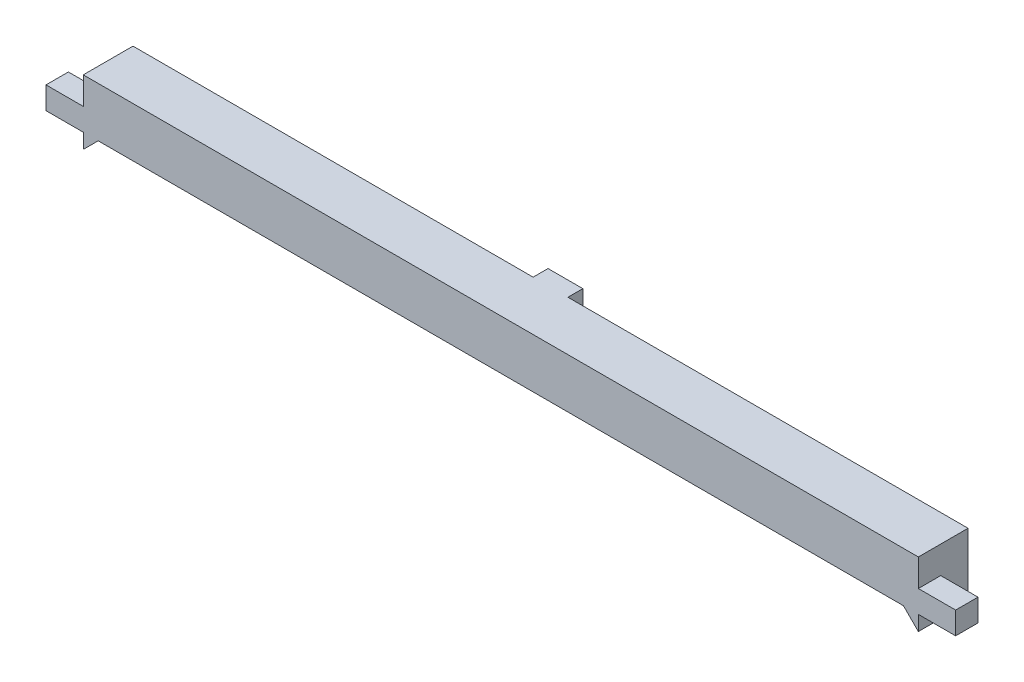
ISO-10303-21;
HEADER;
FILE_DESCRIPTION(('STEP AP214'),'2;1');
FILE_NAME('part.step','',(''),(''),'','','');
FILE_SCHEMA(('AUTOMOTIVE_DESIGN { 1 0 10303 214 1 1 1 1 }'));
ENDSEC;
DATA;
#1=APPLICATION_CONTEXT('core data for automotive mechanical design processes');
#2=APPLICATION_PROTOCOL_DEFINITION('international standard','automotive_design',2000,#1);
#3=PRODUCT_CONTEXT('',#1,'mechanical');
#4=PRODUCT('Part','Part','',(#3));
#5=PRODUCT_RELATED_PRODUCT_CATEGORY('part','',(#4));
#6=PRODUCT_DEFINITION_FORMATION('','',#4);
#7=PRODUCT_DEFINITION_CONTEXT('part definition',#1,'design');
#8=PRODUCT_DEFINITION('design','',#6,#7);
#9=PRODUCT_DEFINITION_SHAPE('','',#8);
#10=(LENGTH_UNIT() NAMED_UNIT(*) SI_UNIT(.MILLI.,.METRE.));
#11=(NAMED_UNIT(*) PLANE_ANGLE_UNIT() SI_UNIT($,.RADIAN.));
#12=(NAMED_UNIT(*) SI_UNIT($,.STERADIAN.) SOLID_ANGLE_UNIT());
#13=UNCERTAINTY_MEASURE_WITH_UNIT(LENGTH_MEASURE(1.E-05),#10,'distance_accuracy_value','');
#14=(GEOMETRIC_REPRESENTATION_CONTEXT(3) GLOBAL_UNCERTAINTY_ASSIGNED_CONTEXT((#13)) GLOBAL_UNIT_ASSIGNED_CONTEXT((#10,
#11,#12)) REPRESENTATION_CONTEXT('',''));
#15=CARTESIAN_POINT('',(0.,0.,0.));
#16=DIRECTION('',(0.,0.,1.));
#17=DIRECTION('',(1.,0.,0.));
#18=AXIS2_PLACEMENT_3D('',#15,#16,#17);
#19=CARTESIAN_POINT('',(-168.,-20.,26.));
#20=DIRECTION('',(0.,1.,0.));
#21=DIRECTION('',(-1.,0.,0.));
#22=AXIS2_PLACEMENT_3D('',#19,#20,#21);
#23=PLANE('',#22);
#24=DIRECTION('',(1.,0.,0.));
#25=VECTOR('',#24,1.);
#26=CARTESIAN_POINT('',(-168.,-20.,26.));
#27=LINE('',#26,#25);
#28=CARTESIAN_POINT('',(-162.,-20.,26.));
#29=VERTEX_POINT('',#28);
#30=CARTESIAN_POINT('',(162.,-19.9999999999999,26.));
#31=VERTEX_POINT('',#30);
#32=EDGE_CURVE('E54',#29,#31,#27,.T.);
#33=ORIENTED_EDGE('',*,*,#32,.F.);
#34=DIRECTION('',(0.,0.,1.));
#35=VECTOR('',#34,1.);
#36=CARTESIAN_POINT('',(-162.,-19.9999999999999,6.));
#37=LINE('',#36,#35);
#38=CARTESIAN_POINT('',(-162.,-19.9999999999999,6.));
#39=VERTEX_POINT('',#38);
#40=EDGE_CURVE('E175',#39,#29,#37,.T.);
#41=ORIENTED_EDGE('',*,*,#40,.F.);
#42=DIRECTION('',(1.,0.,0.));
#43=VECTOR('',#42,1.);
#44=CARTESIAN_POINT('',(-168.,-20.,6.00000000000002));
#45=LINE('',#44,#43);
#46=CARTESIAN_POINT('',(-7.,-20.,6.00000000000002));
#47=VERTEX_POINT('',#46);
#48=EDGE_CURVE('E164',#39,#47,#45,.T.);
#49=ORIENTED_EDGE('',*,*,#48,.T.);
#50=DIRECTION('',(0.,0.,1.));
#51=VECTOR('',#50,1.);
#52=CARTESIAN_POINT('',(-7.00000000000001,-20.,26.));
#53=LINE('',#52,#51);
#54=CARTESIAN_POINT('',(-7.,-20.,0.));
#55=VERTEX_POINT('',#54);
#56=EDGE_CURVE('E272',#55,#47,#53,.T.);
#57=ORIENTED_EDGE('',*,*,#56,.F.);
#58=DIRECTION('',(1.,0.,0.));
#59=VECTOR('',#58,1.);
#60=CARTESIAN_POINT('',(-168.,-20.,0.));
#61=LINE('',#60,#59);
#62=CARTESIAN_POINT('',(7.,-20.,0.));
#63=VERTEX_POINT('',#62);
#64=EDGE_CURVE('E288',#55,#63,#61,.T.);
#65=ORIENTED_EDGE('',*,*,#64,.T.);
#66=DIRECTION('',(0.,0.,1.));
#67=VECTOR('',#66,1.);
#68=CARTESIAN_POINT('',(7.00000000000001,-20.,26.));
#69=LINE('',#68,#67);
#70=CARTESIAN_POINT('',(7.,-20.,6.00000000000002));
#71=VERTEX_POINT('',#70);
#72=EDGE_CURVE('E285',#63,#71,#69,.T.);
#73=ORIENTED_EDGE('',*,*,#72,.T.);
#74=DIRECTION('',(1.,0.,0.));
#75=VECTOR('',#74,1.);
#76=CARTESIAN_POINT('',(-168.,-20.,6.00000000000002));
#77=LINE('',#76,#75);
#78=CARTESIAN_POINT('',(162.,-19.9999999999999,6.));
#79=VERTEX_POINT('',#78);
#80=EDGE_CURVE('E173',#71,#79,#77,.T.);
#81=ORIENTED_EDGE('',*,*,#80,.T.);
#82=DIRECTION('',(0.,0.,1.));
#83=VECTOR('',#82,1.);
#84=CARTESIAN_POINT('',(162.,-19.9999999999999,6.));
#85=LINE('',#84,#83);
#86=EDGE_CURVE('E200',#79,#31,#85,.T.);
#87=ORIENTED_EDGE('',*,*,#86,.T.);
#88=EDGE_LOOP('',(#33,#41,#49,#57,#65,#73,#81,#87));
#89=FACE_BOUND('',#88,.T.);
#90=ADVANCED_FACE('F37',(#89),#23,.F.);
#91=DIRECTION('',(0.,0.,1.));
#92=VECTOR('',#91,1.);
#93=CARTESIAN_POINT('',(168.,-19.9999999999999,6.));
#94=LINE('',#93,#92);
#95=CARTESIAN_POINT('',(168.,-19.9999999999999,17.));
#96=VERTEX_POINT('',#95);
#97=CARTESIAN_POINT('',(168.,-19.9999999999999,26.));
#98=VERTEX_POINT('',#97);
#99=EDGE_CURVE('E11',#96,#98,#94,.T.);
#100=ORIENTED_EDGE('',*,*,#99,.F.);
#101=DIRECTION('',(-1.,0.,0.));
#102=VECTOR('',#101,1.);
#103=CARTESIAN_POINT('',(183.,-19.9999999999999,17.));
#104=LINE('',#103,#102);
#105=CARTESIAN_POINT('',(183.,-19.9999999999999,17.));
#106=VERTEX_POINT('',#105);
#107=EDGE_CURVE('E241',#106,#96,#104,.T.);
#108=ORIENTED_EDGE('',*,*,#107,.F.);
#109=DIRECTION('',(0.,0.,-1.));
#110=VECTOR('',#109,1.);
#111=CARTESIAN_POINT('',(183.,-19.9999999999999,0.));
#112=LINE('',#111,#110);
#113=CARTESIAN_POINT('',(183.,-19.9999999999999,26.));
#114=VERTEX_POINT('',#113);
#115=EDGE_CURVE('E239',#114,#106,#112,.T.);
#116=ORIENTED_EDGE('',*,*,#115,.F.);
#117=EDGE_CURVE('E295',#98,#114,#27,.T.);
#118=ORIENTED_EDGE('',*,*,#117,.F.);
#119=EDGE_LOOP('',(#100,#108,#116,#118));
#120=FACE_BOUND('',#119,.T.);
#121=ADVANCED_FACE('F329',(#120),#23,.F.);
#122=CARTESIAN_POINT('',(-168.,0.,0.));
#123=DIRECTION('',(1.,0.,0.));
#124=DIRECTION('',(0.,1.,0.));
#125=AXIS2_PLACEMENT_3D('',#122,#123,#124);
#126=PLANE('',#125);
#127=DIRECTION('',(0.,-1.,0.));
#128=VECTOR('',#127,1.);
#129=CARTESIAN_POINT('',(-168.,0.,17.));
#130=LINE('',#129,#128);
#131=CARTESIAN_POINT('',(-168.,-11.,17.));
#132=VERTEX_POINT('',#131);
#133=CARTESIAN_POINT('',(-168.,-20.,17.));
#134=VERTEX_POINT('',#133);
#135=EDGE_CURVE('E201',#132,#134,#130,.T.);
#136=ORIENTED_EDGE('',*,*,#135,.F.);
#137=DIRECTION('',(0.,0.,-1.));
#138=VECTOR('',#137,1.);
#139=CARTESIAN_POINT('',(-168.,-11.,0.));
#140=LINE('',#139,#138);
#141=CARTESIAN_POINT('',(-168.,-11.,26.));
#142=VERTEX_POINT('',#141);
#143=EDGE_CURVE('E208',#142,#132,#140,.T.);
#144=ORIENTED_EDGE('',*,*,#143,.F.);
#145=DIRECTION('',(0.,-1.,0.));
#146=VECTOR('',#145,1.);
#147=CARTESIAN_POINT('',(-168.,0.,26.));
#148=LINE('',#147,#146);
#149=CARTESIAN_POINT('',(-168.,0.,26.));
#150=VERTEX_POINT('',#149);
#151=EDGE_CURVE('E267',#150,#142,#148,.T.);
#152=ORIENTED_EDGE('',*,*,#151,.F.);
#153=DIRECTION('',(0.,0.,1.));
#154=VECTOR('',#153,1.);
#155=CARTESIAN_POINT('',(-168.,0.,0.));
#156=LINE('',#155,#154);
#157=CARTESIAN_POINT('',(-168.,0.,6.00000000000002));
#158=VERTEX_POINT('',#157);
#159=EDGE_CURVE('E41',#158,#150,#156,.T.);
#160=ORIENTED_EDGE('',*,*,#159,.F.);
#161=DIRECTION('',(0.,1.,0.));
#162=VECTOR('',#161,1.);
#163=CARTESIAN_POINT('',(-168.,-52.,6.00000000000002));
#164=LINE('',#163,#162);
#165=CARTESIAN_POINT('',(-168.,-25.9999999999999,6.));
#166=VERTEX_POINT('',#165);
#167=EDGE_CURVE('E264',#166,#158,#164,.T.);
#168=ORIENTED_EDGE('',*,*,#167,.F.);
#169=DIRECTION('',(0.,0.,1.));
#170=VECTOR('',#169,1.);
#171=CARTESIAN_POINT('',(-168.,-25.9999999999999,6.));
#172=LINE('',#171,#170);
#173=CARTESIAN_POINT('',(-168.,-25.9999999999999,26.));
#174=VERTEX_POINT('',#173);
#175=EDGE_CURVE('E182',#166,#174,#172,.T.);
#176=ORIENTED_EDGE('',*,*,#175,.T.);
#177=DIRECTION('',(0.,-1.,0.));
#178=VECTOR('',#177,1.);
#179=CARTESIAN_POINT('',(-168.,7.77156117237612E-13,26.));
#180=LINE('',#179,#178);
#181=CARTESIAN_POINT('',(-168.,-20.,26.));
#182=VERTEX_POINT('',#181);
#183=EDGE_CURVE('E183',#182,#174,#180,.T.);
#184=ORIENTED_EDGE('',*,*,#183,.F.);
#185=DIRECTION('',(0.,0.,1.));
#186=VECTOR('',#185,1.);
#187=CARTESIAN_POINT('',(-168.,-19.9999999999999,6.));
#188=LINE('',#187,#186);
#189=EDGE_CURVE('E62',#134,#182,#188,.T.);
#190=ORIENTED_EDGE('',*,*,#189,.F.);
#191=EDGE_LOOP('',(#136,#144,#152,#160,#168,#176,#184,#190));
#192=FACE_BOUND('',#191,.T.);
#193=ADVANCED_FACE('F39',(#192),#126,.F.);
#194=CARTESIAN_POINT('',(0.,0.,0.));
#195=DIRECTION('',(0.,0.,1.));
#196=DIRECTION('',(1.,0.,0.));
#197=AXIS2_PLACEMENT_3D('',#194,#195,#196);
#198=PLANE('',#197);
#199=DIRECTION('',(0.,1.,0.));
#200=VECTOR('',#199,1.);
#201=CARTESIAN_POINT('',(-7.,-52.,0.));
#202=LINE('',#201,#200);
#203=CARTESIAN_POINT('',(-7.00000000000001,0.,0.));
#204=VERTEX_POINT('',#203);
#205=EDGE_CURVE('E253',#55,#204,#202,.T.);
#206=ORIENTED_EDGE('',*,*,#205,.T.);
#207=DIRECTION('',(1.,0.,0.));
#208=VECTOR('',#207,1.);
#209=CARTESIAN_POINT('',(168.,0.,0.));
#210=LINE('',#209,#208);
#211=CARTESIAN_POINT('',(7.,0.,0.));
#212=VERTEX_POINT('',#211);
#213=EDGE_CURVE('E270',#204,#212,#210,.T.);
#214=ORIENTED_EDGE('',*,*,#213,.T.);
#215=DIRECTION('',(0.,1.,0.));
#216=VECTOR('',#215,1.);
#217=CARTESIAN_POINT('',(7.00000000000001,-52.,0.));
#218=LINE('',#217,#216);
#219=EDGE_CURVE('E277',#63,#212,#218,.T.);
#220=ORIENTED_EDGE('',*,*,#219,.F.);
#221=ORIENTED_EDGE('',*,*,#64,.F.);
#222=EDGE_LOOP('',(#206,#214,#220,#221));
#223=FACE_BOUND('',#222,.T.);
#224=ADVANCED_FACE('F345',(#223),#198,.F.);
#225=DIRECTION('',(1.,0.,0.));
#226=VECTOR('',#225,1.);
#227=CARTESIAN_POINT('',(-183.,-19.9999999999999,17.));
#228=LINE('',#227,#226);
#229=CARTESIAN_POINT('',(-183.,-19.9999999999999,17.));
#230=VERTEX_POINT('',#229);
#231=EDGE_CURVE('E226',#230,#134,#228,.T.);
#232=ORIENTED_EDGE('',*,*,#231,.T.);
#233=ORIENTED_EDGE('',*,*,#189,.T.);
#234=CARTESIAN_POINT('',(-183.,-19.9999999999999,26.));
#235=VERTEX_POINT('',#234);
#236=EDGE_CURVE('E257',#235,#182,#27,.T.);
#237=ORIENTED_EDGE('',*,*,#236,.F.);
#238=DIRECTION('',(0.,0.,-1.));
#239=VECTOR('',#238,1.);
#240=CARTESIAN_POINT('',(-183.,-19.9999999999999,0.));
#241=LINE('',#240,#239);
#242=EDGE_CURVE('E207',#235,#230,#241,.T.);
#243=ORIENTED_EDGE('',*,*,#242,.T.);
#244=EDGE_LOOP('',(#232,#233,#237,#243));
#245=FACE_BOUND('',#244,.T.);
#246=ADVANCED_FACE('F347',(#245),#23,.F.);
#247=CARTESIAN_POINT('',(168.,0.,26.));
#248=DIRECTION('',(0.,1.,0.));
#249=DIRECTION('',(-1.,0.,0.));
#250=AXIS2_PLACEMENT_3D('',#247,#248,#249);
#251=PLANE('',#250);
#252=ORIENTED_EDGE('',*,*,#159,.T.);
#253=DIRECTION('',(-1.,0.,0.));
#254=VECTOR('',#253,1.);
#255=CARTESIAN_POINT('',(-168.,0.,26.));
#256=LINE('',#255,#254);
#257=CARTESIAN_POINT('',(168.,0.,26.));
#258=VERTEX_POINT('',#257);
#259=EDGE_CURVE('E256',#258,#150,#256,.T.);
#260=ORIENTED_EDGE('',*,*,#259,.F.);
#261=DIRECTION('',(0.,0.,-1.));
#262=VECTOR('',#261,1.);
#263=CARTESIAN_POINT('',(168.,0.,0.));
#264=LINE('',#263,#262);
#265=CARTESIAN_POINT('',(168.,0.,6.00000000000002));
#266=VERTEX_POINT('',#265);
#267=EDGE_CURVE('E258',#258,#266,#264,.T.);
#268=ORIENTED_EDGE('',*,*,#267,.T.);
#269=DIRECTION('',(1.,0.,0.));
#270=VECTOR('',#269,1.);
#271=CARTESIAN_POINT('',(0.,0.,6.00000000000002));
#272=LINE('',#271,#270);
#273=CARTESIAN_POINT('',(7.,0.,6.00000000000002));
#274=VERTEX_POINT('',#273);
#275=EDGE_CURVE('E274',#274,#266,#272,.T.);
#276=ORIENTED_EDGE('',*,*,#275,.F.);
#277=DIRECTION('',(0.,0.,1.));
#278=VECTOR('',#277,1.);
#279=CARTESIAN_POINT('',(7.,0.,0.));
#280=LINE('',#279,#278);
#281=EDGE_CURVE('E279',#212,#274,#280,.T.);
#282=ORIENTED_EDGE('',*,*,#281,.F.);
#283=ORIENTED_EDGE('',*,*,#213,.F.);
#284=DIRECTION('',(0.,0.,1.));
#285=VECTOR('',#284,1.);
#286=CARTESIAN_POINT('',(-7.00000000000001,0.,0.));
#287=LINE('',#286,#285);
#288=CARTESIAN_POINT('',(-7.00000000000001,0.,6.00000000000002));
#289=VERTEX_POINT('',#288);
#290=EDGE_CURVE('E261',#204,#289,#287,.T.);
#291=ORIENTED_EDGE('',*,*,#290,.T.);
#292=DIRECTION('',(1.,0.,0.));
#293=VECTOR('',#292,1.);
#294=CARTESIAN_POINT('',(0.,0.,6.00000000000002));
#295=LINE('',#294,#293);
#296=EDGE_CURVE('E262',#158,#289,#295,.T.);
#297=ORIENTED_EDGE('',*,*,#296,.F.);
#298=EDGE_LOOP('',(#252,#260,#268,#276,#282,#283,#291,#297));
#299=FACE_BOUND('',#298,.T.);
#300=ADVANCED_FACE('F322',(#299),#251,.T.);
#301=CARTESIAN_POINT('',(0.,0.,26.));
#302=DIRECTION('',(0.,0.,1.));
#303=DIRECTION('',(1.,0.,0.));
#304=AXIS2_PLACEMENT_3D('',#301,#302,#303);
#305=PLANE('',#304);
#306=ORIENTED_EDGE('',*,*,#151,.T.);
#307=DIRECTION('',(1.,0.,0.));
#308=VECTOR('',#307,1.);
#309=CARTESIAN_POINT('',(-183.,-11.,26.));
#310=LINE('',#309,#308);
#311=CARTESIAN_POINT('',(-183.,-11.,26.));
#312=VERTEX_POINT('',#311);
#313=EDGE_CURVE('E223',#312,#142,#310,.T.);
#314=ORIENTED_EDGE('',*,*,#313,.F.);
#315=DIRECTION('',(0.,-1.,0.));
#316=VECTOR('',#315,1.);
#317=CARTESIAN_POINT('',(-183.,0.,26.));
#318=LINE('',#317,#316);
#319=EDGE_CURVE('E211',#312,#235,#318,.T.);
#320=ORIENTED_EDGE('',*,*,#319,.T.);
#321=ORIENTED_EDGE('',*,*,#236,.T.);
#322=ORIENTED_EDGE('',*,*,#183,.T.);
#323=DIRECTION('',(0.70710678118655,0.707106781186546,0.));
#324=VECTOR('',#323,1.);
#325=CARTESIAN_POINT('',(-70.9999999999996,71.,26.));
#326=LINE('',#325,#324);
#327=EDGE_CURVE('E186',#174,#29,#326,.T.);
#328=ORIENTED_EDGE('',*,*,#327,.T.);
#329=ORIENTED_EDGE('',*,*,#32,.T.);
#330=DIRECTION('',(-0.70710678118655,0.707106781186546,0.));
#331=VECTOR('',#330,1.);
#332=CARTESIAN_POINT('',(70.9999999999996,71.,26.));
#333=LINE('',#332,#331);
#334=CARTESIAN_POINT('',(168.,-25.9999999999999,26.));
#335=VERTEX_POINT('',#334);
#336=EDGE_CURVE('E191',#335,#31,#333,.T.);
#337=ORIENTED_EDGE('',*,*,#336,.F.);
#338=DIRECTION('',(0.,-1.,0.));
#339=VECTOR('',#338,1.);
#340=CARTESIAN_POINT('',(168.,7.77156117237612E-13,26.));
#341=LINE('',#340,#339);
#342=EDGE_CURVE('E196',#98,#335,#341,.T.);
#343=ORIENTED_EDGE('',*,*,#342,.F.);
#344=ORIENTED_EDGE('',*,*,#117,.T.);
#345=DIRECTION('',(0.,-1.,0.));
#346=VECTOR('',#345,1.);
#347=CARTESIAN_POINT('',(183.,0.,26.));
#348=LINE('',#347,#346);
#349=CARTESIAN_POINT('',(183.,-11.,26.));
#350=VERTEX_POINT('',#349);
#351=EDGE_CURVE('E236',#350,#114,#348,.T.);
#352=ORIENTED_EDGE('',*,*,#351,.F.);
#353=DIRECTION('',(-1.,0.,0.));
#354=VECTOR('',#353,1.);
#355=CARTESIAN_POINT('',(183.,-11.,26.));
#356=LINE('',#355,#354);
#357=CARTESIAN_POINT('',(168.,-11.,26.));
#358=VERTEX_POINT('',#357);
#359=EDGE_CURVE('E248',#350,#358,#356,.T.);
#360=ORIENTED_EDGE('',*,*,#359,.T.);
#361=DIRECTION('',(0.,1.,0.));
#362=VECTOR('',#361,1.);
#363=CARTESIAN_POINT('',(168.,0.,26.));
#364=LINE('',#363,#362);
#365=EDGE_CURVE('E254',#358,#258,#364,.T.);
#366=ORIENTED_EDGE('',*,*,#365,.T.);
#367=ORIENTED_EDGE('',*,*,#259,.T.);
#368=EDGE_LOOP('',(#306,#314,#320,#321,#322,#328,#329,#337,#343,#344,#352,#360,#366,#367));
#369=FACE_BOUND('',#368,.T.);
#370=ADVANCED_FACE('F305',(#369),#305,.T.);
#371=CARTESIAN_POINT('',(0.,-52.,6.00000000000002));
#372=DIRECTION('',(0.,0.,1.));
#373=DIRECTION('',(1.,0.,0.));
#374=AXIS2_PLACEMENT_3D('',#371,#372,#373);
#375=PLANE('',#374);
#376=DIRECTION('',(0.,1.,0.));
#377=VECTOR('',#376,1.);
#378=CARTESIAN_POINT('',(7.00000000000001,-52.,6.00000000000002));
#379=LINE('',#378,#377);
#380=EDGE_CURVE('E278',#71,#274,#379,.T.);
#381=ORIENTED_EDGE('',*,*,#380,.T.);
#382=ORIENTED_EDGE('',*,*,#275,.T.);
#383=DIRECTION('',(0.,1.,0.));
#384=VECTOR('',#383,1.);
#385=CARTESIAN_POINT('',(168.,-52.,6.00000000000002));
#386=LINE('',#385,#384);
#387=CARTESIAN_POINT('',(168.,-25.9999999999999,6.));
#388=VERTEX_POINT('',#387);
#389=EDGE_CURVE('E46',#388,#266,#386,.T.);
#390=ORIENTED_EDGE('',*,*,#389,.F.);
#391=DIRECTION('',(-0.70710678118655,0.707106781186546,0.));
#392=VECTOR('',#391,1.);
#393=CARTESIAN_POINT('',(70.9999999999996,71.,6.));
#394=LINE('',#393,#392);
#395=EDGE_CURVE('E193',#388,#79,#394,.T.);
#396=ORIENTED_EDGE('',*,*,#395,.T.);
#397=ORIENTED_EDGE('',*,*,#80,.F.);
#398=EDGE_LOOP('',(#381,#382,#390,#396,#397));
#399=FACE_BOUND('',#398,.T.);
#400=ADVANCED_FACE('F313',(#399),#375,.F.);
#401=CARTESIAN_POINT('',(7.00000000000001,-52.,0.));
#402=DIRECTION('',(-1.,0.,0.));
#403=DIRECTION('',(0.,0.,1.));
#404=AXIS2_PLACEMENT_3D('',#401,#402,#403);
#405=PLANE('',#404);
#406=ORIENTED_EDGE('',*,*,#219,.T.);
#407=ORIENTED_EDGE('',*,*,#281,.T.);
#408=ORIENTED_EDGE('',*,*,#380,.F.);
#409=ORIENTED_EDGE('',*,*,#72,.F.);
#410=EDGE_LOOP('',(#406,#407,#408,#409));
#411=FACE_BOUND('',#410,.T.);
#412=ADVANCED_FACE('F315',(#411),#405,.F.);
#413=CARTESIAN_POINT('',(-7.,-52.,0.));
#414=DIRECTION('',(-1.,0.,0.));
#415=DIRECTION('',(0.,-1.,0.));
#416=AXIS2_PLACEMENT_3D('',#413,#414,#415);
#417=PLANE('',#416);
#418=ORIENTED_EDGE('',*,*,#56,.T.);
#419=DIRECTION('',(0.,1.,0.));
#420=VECTOR('',#419,1.);
#421=CARTESIAN_POINT('',(-7.,-52.,6.00000000000002));
#422=LINE('',#421,#420);
#423=EDGE_CURVE('E170',#47,#289,#422,.T.);
#424=ORIENTED_EDGE('',*,*,#423,.T.);
#425=ORIENTED_EDGE('',*,*,#290,.F.);
#426=ORIENTED_EDGE('',*,*,#205,.F.);
#427=EDGE_LOOP('',(#418,#424,#425,#426));
#428=FACE_BOUND('',#427,.T.);
#429=ADVANCED_FACE('F342',(#428),#417,.T.);
#430=CARTESIAN_POINT('',(0.,-52.,6.00000000000002));
#431=DIRECTION('',(0.,0.,1.));
#432=DIRECTION('',(1.,0.,0.));
#433=AXIS2_PLACEMENT_3D('',#430,#431,#432);
#434=PLANE('',#433);
#435=ORIENTED_EDGE('',*,*,#167,.T.);
#436=ORIENTED_EDGE('',*,*,#296,.T.);
#437=ORIENTED_EDGE('',*,*,#423,.F.);
#438=ORIENTED_EDGE('',*,*,#48,.F.);
#439=DIRECTION('',(0.70710678118655,0.707106781186546,0.));
#440=VECTOR('',#439,1.);
#441=CARTESIAN_POINT('',(-70.9999999999996,71.,6.));
#442=LINE('',#441,#440);
#443=EDGE_CURVE('E168',#166,#39,#442,.T.);
#444=ORIENTED_EDGE('',*,*,#443,.F.);
#445=EDGE_LOOP('',(#435,#436,#437,#438,#444));
#446=FACE_BOUND('',#445,.T.);
#447=ADVANCED_FACE('F166',(#446),#434,.F.);
#448=CARTESIAN_POINT('',(168.,0.,0.));
#449=DIRECTION('',(-1.,0.,0.));
#450=DIRECTION('',(0.,-1.,0.));
#451=AXIS2_PLACEMENT_3D('',#448,#449,#450);
#452=PLANE('',#451);
#453=DIRECTION('',(0.,0.,-1.));
#454=VECTOR('',#453,1.);
#455=CARTESIAN_POINT('',(168.,-11.,0.));
#456=LINE('',#455,#454);
#457=CARTESIAN_POINT('',(168.,-11.,17.));
#458=VERTEX_POINT('',#457);
#459=EDGE_CURVE('E233',#358,#458,#456,.T.);
#460=ORIENTED_EDGE('',*,*,#459,.T.);
#461=DIRECTION('',(0.,-1.,0.));
#462=VECTOR('',#461,1.);
#463=CARTESIAN_POINT('',(168.,0.,17.));
#464=LINE('',#463,#462);
#465=EDGE_CURVE('E228',#458,#96,#464,.T.);
#466=ORIENTED_EDGE('',*,*,#465,.T.);
#467=ORIENTED_EDGE('',*,*,#99,.T.);
#468=ORIENTED_EDGE('',*,*,#342,.T.);
#469=DIRECTION('',(0.,0.,1.));
#470=VECTOR('',#469,1.);
#471=CARTESIAN_POINT('',(168.,-25.9999999999999,6.));
#472=LINE('',#471,#470);
#473=EDGE_CURVE('E195',#388,#335,#472,.T.);
#474=ORIENTED_EDGE('',*,*,#473,.F.);
#475=ORIENTED_EDGE('',*,*,#389,.T.);
#476=ORIENTED_EDGE('',*,*,#267,.F.);
#477=ORIENTED_EDGE('',*,*,#365,.F.);
#478=EDGE_LOOP('',(#460,#466,#467,#468,#474,#475,#476,#477));
#479=FACE_BOUND('',#478,.T.);
#480=ADVANCED_FACE('F326',(#479),#452,.F.);
#481=CARTESIAN_POINT('',(183.,0.,17.));
#482=DIRECTION('',(0.,0.,-1.));
#483=DIRECTION('',(-1.,0.,0.));
#484=AXIS2_PLACEMENT_3D('',#481,#482,#483);
#485=PLANE('',#484);
#486=ORIENTED_EDGE('',*,*,#465,.F.);
#487=DIRECTION('',(-1.,0.,0.));
#488=VECTOR('',#487,1.);
#489=CARTESIAN_POINT('',(183.,-11.,17.));
#490=LINE('',#489,#488);
#491=CARTESIAN_POINT('',(183.,-11.,17.));
#492=VERTEX_POINT('',#491);
#493=EDGE_CURVE('E250',#492,#458,#490,.T.);
#494=ORIENTED_EDGE('',*,*,#493,.F.);
#495=DIRECTION('',(0.,-1.,0.));
#496=VECTOR('',#495,1.);
#497=CARTESIAN_POINT('',(183.,0.,17.));
#498=LINE('',#497,#496);
#499=EDGE_CURVE('E229',#492,#106,#498,.T.);
#500=ORIENTED_EDGE('',*,*,#499,.T.);
#501=ORIENTED_EDGE('',*,*,#107,.T.);
#502=EDGE_LOOP('',(#486,#494,#500,#501));
#503=FACE_BOUND('',#502,.T.);
#504=ADVANCED_FACE('F377',(#503),#485,.T.);
#505=CARTESIAN_POINT('',(183.,-11.,0.));
#506=DIRECTION('',(0.,1.,0.));
#507=DIRECTION('',(-1.,0.,0.));
#508=AXIS2_PLACEMENT_3D('',#505,#506,#507);
#509=PLANE('',#508);
#510=ORIENTED_EDGE('',*,*,#459,.F.);
#511=ORIENTED_EDGE('',*,*,#359,.F.);
#512=DIRECTION('',(0.,0.,-1.));
#513=VECTOR('',#512,1.);
#514=CARTESIAN_POINT('',(183.,-11.,0.));
#515=LINE('',#514,#513);
#516=EDGE_CURVE('E232',#350,#492,#515,.T.);
#517=ORIENTED_EDGE('',*,*,#516,.T.);
#518=ORIENTED_EDGE('',*,*,#493,.T.);
#519=EDGE_LOOP('',(#510,#511,#517,#518));
#520=FACE_BOUND('',#519,.T.);
#521=ADVANCED_FACE('F338',(#520),#509,.T.);
#522=CARTESIAN_POINT('',(183.,0.,0.));
#523=DIRECTION('',(1.,0.,0.));
#524=DIRECTION('',(0.,1.,0.));
#525=AXIS2_PLACEMENT_3D('',#522,#523,#524);
#526=PLANE('',#525);
#527=ORIENTED_EDGE('',*,*,#499,.F.);
#528=ORIENTED_EDGE('',*,*,#516,.F.);
#529=ORIENTED_EDGE('',*,*,#351,.T.);
#530=ORIENTED_EDGE('',*,*,#115,.T.);
#531=EDGE_LOOP('',(#527,#528,#529,#530));
#532=FACE_BOUND('',#531,.T.);
#533=ADVANCED_FACE('F333',(#532),#526,.T.);
#534=CARTESIAN_POINT('',(-183.,0.,17.));
#535=DIRECTION('',(0.,0.,1.));
#536=DIRECTION('',(1.,0.,0.));
#537=AXIS2_PLACEMENT_3D('',#534,#535,#536);
#538=PLANE('',#537);
#539=ORIENTED_EDGE('',*,*,#135,.T.);
#540=ORIENTED_EDGE('',*,*,#231,.F.);
#541=DIRECTION('',(0.,-1.,0.));
#542=VECTOR('',#541,1.);
#543=CARTESIAN_POINT('',(-183.,0.,17.));
#544=LINE('',#543,#542);
#545=CARTESIAN_POINT('',(-183.,-11.,17.));
#546=VERTEX_POINT('',#545);
#547=EDGE_CURVE('E205',#546,#230,#544,.T.);
#548=ORIENTED_EDGE('',*,*,#547,.F.);
#549=DIRECTION('',(1.,0.,0.));
#550=VECTOR('',#549,1.);
#551=CARTESIAN_POINT('',(-183.,-11.,17.));
#552=LINE('',#551,#550);
#553=EDGE_CURVE('E216',#546,#132,#552,.T.);
#554=ORIENTED_EDGE('',*,*,#553,.T.);
#555=EDGE_LOOP('',(#539,#540,#548,#554));
#556=FACE_BOUND('',#555,.T.);
#557=ADVANCED_FACE('F385',(#556),#538,.F.);
#558=CARTESIAN_POINT('',(-183.,-11.,0.));
#559=DIRECTION('',(0.,-1.,0.));
#560=DIRECTION('',(1.,0.,0.));
#561=AXIS2_PLACEMENT_3D('',#558,#559,#560);
#562=PLANE('',#561);
#563=ORIENTED_EDGE('',*,*,#143,.T.);
#564=ORIENTED_EDGE('',*,*,#553,.F.);
#565=DIRECTION('',(0.,0.,-1.));
#566=VECTOR('',#565,1.);
#567=CARTESIAN_POINT('',(-183.,-11.,0.));
#568=LINE('',#567,#566);
#569=EDGE_CURVE('E214',#312,#546,#568,.T.);
#570=ORIENTED_EDGE('',*,*,#569,.F.);
#571=ORIENTED_EDGE('',*,*,#313,.T.);
#572=EDGE_LOOP('',(#563,#564,#570,#571));
#573=FACE_BOUND('',#572,.T.);
#574=ADVANCED_FACE('F388',(#573),#562,.F.);
#575=CARTESIAN_POINT('',(-183.,0.,0.));
#576=DIRECTION('',(-1.,0.,0.));
#577=DIRECTION('',(0.,1.,0.));
#578=AXIS2_PLACEMENT_3D('',#575,#576,#577);
#579=PLANE('',#578);
#580=ORIENTED_EDGE('',*,*,#547,.T.);
#581=ORIENTED_EDGE('',*,*,#242,.F.);
#582=ORIENTED_EDGE('',*,*,#319,.F.);
#583=ORIENTED_EDGE('',*,*,#569,.T.);
#584=EDGE_LOOP('',(#580,#581,#582,#583));
#585=FACE_BOUND('',#584,.T.);
#586=ADVANCED_FACE('F392',(#585),#579,.T.);
#587=CARTESIAN_POINT('',(70.9999999999996,71.,6.));
#588=DIRECTION('',(0.707106781186546,0.70710678118655,0.));
#589=DIRECTION('',(-0.70710678118655,0.707106781186546,0.));
#590=AXIS2_PLACEMENT_3D('',#587,#588,#589);
#591=PLANE('',#590);
#592=ORIENTED_EDGE('',*,*,#336,.T.);
#593=ORIENTED_EDGE('',*,*,#86,.F.);
#594=ORIENTED_EDGE('',*,*,#395,.F.);
#595=ORIENTED_EDGE('',*,*,#473,.T.);
#596=EDGE_LOOP('',(#592,#593,#594,#595));
#597=FACE_BOUND('',#596,.T.);
#598=ADVANCED_FACE('F308',(#597),#591,.F.);
#599=CARTESIAN_POINT('',(-70.9999999999996,71.,6.));
#600=DIRECTION('',(0.707106781186546,-0.70710678118655,0.));
#601=DIRECTION('',(0.70710678118655,0.707106781186546,0.));
#602=AXIS2_PLACEMENT_3D('',#599,#600,#601);
#603=PLANE('',#602);
#604=ORIENTED_EDGE('',*,*,#327,.F.);
#605=ORIENTED_EDGE('',*,*,#175,.F.);
#606=ORIENTED_EDGE('',*,*,#443,.T.);
#607=ORIENTED_EDGE('',*,*,#40,.T.);
#608=EDGE_LOOP('',(#604,#605,#606,#607));
#609=FACE_BOUND('',#608,.T.);
#610=ADVANCED_FACE('F181',(#609),#603,.T.);
#611=CLOSED_SHELL('',(#90,#121,#193,#224,#246,#300,#370,#400,#412,#429,#447,#480,#504,#521,#533,
#557,#574,#586,#598,#610));
#612=MANIFOLD_SOLID_BREP('B2',#611);
#613=ADVANCED_BREP_SHAPE_REPRESENTATION('',(#18,#612),#14);
#614=SHAPE_DEFINITION_REPRESENTATION(#9,#613);
ENDSEC;
END-ISO-10303-21;
